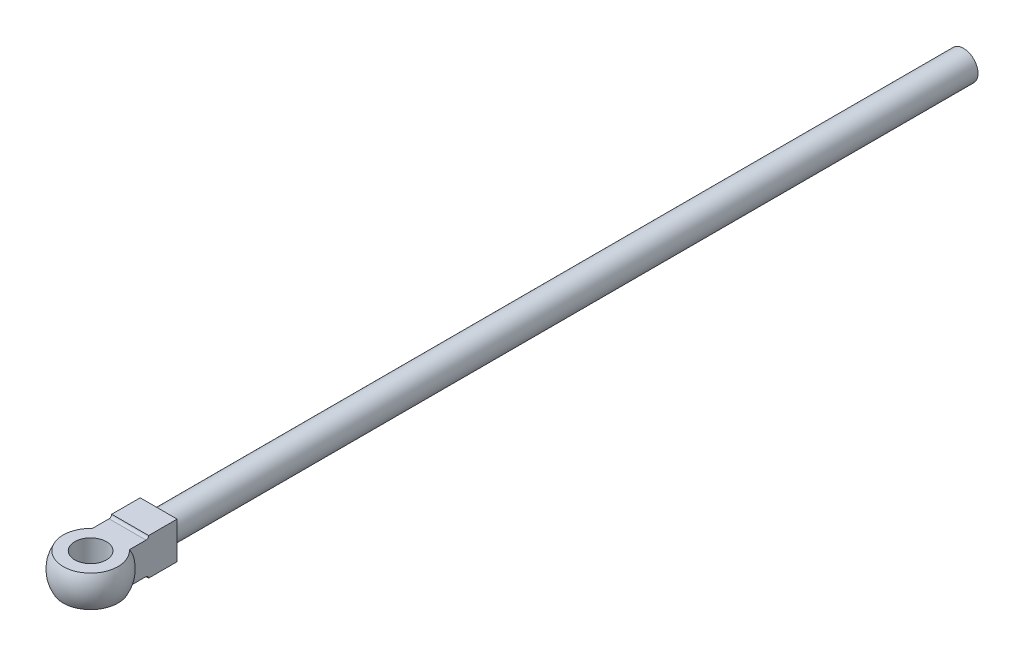
ISO-10303-21;
HEADER;
FILE_DESCRIPTION(('STEP AP214'),'2;1');
FILE_NAME('part.step','',(''),(''),'','','');
FILE_SCHEMA(('AUTOMOTIVE_DESIGN { 1 0 10303 214 1 1 1 1 }'));
ENDSEC;
DATA;
#1=APPLICATION_CONTEXT('core data for automotive mechanical design processes');
#2=APPLICATION_PROTOCOL_DEFINITION('international standard','automotive_design',2000,#1);
#3=PRODUCT_CONTEXT('',#1,'mechanical');
#4=PRODUCT('Part','Part','',(#3));
#5=PRODUCT_RELATED_PRODUCT_CATEGORY('part','',(#4));
#6=PRODUCT_DEFINITION_FORMATION('','',#4);
#7=PRODUCT_DEFINITION_CONTEXT('part definition',#1,'design');
#8=PRODUCT_DEFINITION('design','',#6,#7);
#9=PRODUCT_DEFINITION_SHAPE('','',#8);
#10=(LENGTH_UNIT() NAMED_UNIT(*) SI_UNIT(.MILLI.,.METRE.));
#11=(NAMED_UNIT(*) PLANE_ANGLE_UNIT() SI_UNIT($,.RADIAN.));
#12=(NAMED_UNIT(*) SI_UNIT($,.STERADIAN.) SOLID_ANGLE_UNIT());
#13=UNCERTAINTY_MEASURE_WITH_UNIT(LENGTH_MEASURE(1.E-05),#10,'distance_accuracy_value','');
#14=(GEOMETRIC_REPRESENTATION_CONTEXT(3) GLOBAL_UNCERTAINTY_ASSIGNED_CONTEXT((#13)) GLOBAL_UNIT_ASSIGNED_CONTEXT((#10,
#11,#12)) REPRESENTATION_CONTEXT('',''));
#15=CARTESIAN_POINT('',(0.,0.,0.));
#16=DIRECTION('',(0.,0.,1.));
#17=DIRECTION('',(1.,0.,0.));
#18=AXIS2_PLACEMENT_3D('',#15,#16,#17);
#19=CARTESIAN_POINT('',(-30.,30.,0.));
#20=DIRECTION('',(0.,-1.,0.));
#21=DIRECTION('',(0.,0.,-1.));
#22=AXIS2_PLACEMENT_3D('',#19,#20,#21);
#23=PLANE('',#22);
#24=DIRECTION('',(0.,0.,1.));
#25=VECTOR('',#24,1.);
#26=CARTESIAN_POINT('',(35.,30.,0.));
#27=LINE('',#26,#25);
#28=CARTESIAN_POINT('',(35.,30.,-70.));
#29=VERTEX_POINT('',#28);
#30=CARTESIAN_POINT('',(35.,30.,-38.405728739343));
#31=VERTEX_POINT('',#30);
#32=EDGE_CURVE('E198',#29,#31,#27,.T.);
#33=ORIENTED_EDGE('',*,*,#32,.F.);
#34=DIRECTION('',(1.,0.,0.));
#35=VECTOR('',#34,1.);
#36=CARTESIAN_POINT('',(-35.,30.,-70.));
#37=LINE('',#36,#35);
#38=CARTESIAN_POINT('',(-35.,30.,-70.));
#39=VERTEX_POINT('',#38);
#40=EDGE_CURVE('E151',#29,#39,#37,.F.);
#41=ORIENTED_EDGE('',*,*,#40,.T.);
#42=DIRECTION('',(0.,0.,-1.));
#43=VECTOR('',#42,1.);
#44=CARTESIAN_POINT('',(-35.,30.,0.));
#45=LINE('',#44,#43);
#46=CARTESIAN_POINT('',(-35.,30.,-38.405728739343));
#47=VERTEX_POINT('',#46);
#48=EDGE_CURVE('E193',#47,#39,#45,.T.);
#49=ORIENTED_EDGE('',*,*,#48,.F.);
#50=CARTESIAN_POINT('',(0.,30.,0.));
#51=DIRECTION('',(0.,-1.,0.));
#52=DIRECTION('',(0.,0.,-1.));
#53=AXIS2_PLACEMENT_3D('',#50,#51,#52);
#54=CIRCLE('',#53,51.9615242270663);
#55=EDGE_CURVE('E141',#31,#47,#54,.T.);
#56=ORIENTED_EDGE('',*,*,#55,.F.);
#57=EDGE_LOOP('',(#33,#41,#49,#56));
#58=FACE_BOUND('',#57,.T.);
#59=CARTESIAN_POINT('',(0.,30.,0.));
#60=DIRECTION('',(0.,-1.,0.));
#61=DIRECTION('',(0.,0.,-1.));
#62=AXIS2_PLACEMENT_3D('',#59,#60,#61);
#63=CIRCLE('',#62,30.);
#64=CARTESIAN_POINT('',(0.,30.,-30.));
#65=VERTEX_POINT('',#64);
#66=EDGE_CURVE('E211',#65,#65,#63,.T.);
#67=ORIENTED_EDGE('',*,*,#66,.T.);
#68=EDGE_LOOP('',(#67));
#69=FACE_BOUND('',#68,.T.);
#70=ADVANCED_FACE('F36',(#58,#69),#23,.F.);
#71=CARTESIAN_POINT('',(0.,0.,0.));
#72=DIRECTION('',(0.,-1.,0.));
#73=DIRECTION('',(-1.,0.,0.));
#74=AXIS2_PLACEMENT_3D('',#71,#72,#73);
#75=SPHERICAL_SURFACE('',#74,60.);
#76=CARTESIAN_POINT('',(35.,0.,0.));
#77=DIRECTION('',(-1.,0.,0.));
#78=DIRECTION('',(0.,0.,1.));
#79=AXIS2_PLACEMENT_3D('',#76,#77,#78);
#80=CIRCLE('',#79,48.7339717240448);
#81=CARTESIAN_POINT('',(35.,-30.,-38.405728739343));
#82=VERTEX_POINT('',#81);
#83=EDGE_CURVE('E209',#31,#82,#80,.T.);
#84=ORIENTED_EDGE('',*,*,#83,.F.);
#85=ORIENTED_EDGE('',*,*,#55,.T.);
#86=CARTESIAN_POINT('',(-35.,0.,0.));
#87=DIRECTION('',(1.,0.,0.));
#88=DIRECTION('',(0.,0.,-1.));
#89=AXIS2_PLACEMENT_3D('',#86,#87,#88);
#90=CIRCLE('',#89,48.7339717240448);
#91=CARTESIAN_POINT('',(-35.,-30.,-38.405728739343));
#92=VERTEX_POINT('',#91);
#93=EDGE_CURVE('E207',#92,#47,#90,.T.);
#94=ORIENTED_EDGE('',*,*,#93,.F.);
#95=CARTESIAN_POINT('',(0.,-30.,0.));
#96=DIRECTION('',(0.,-1.,0.));
#97=DIRECTION('',(0.,0.,-1.));
#98=AXIS2_PLACEMENT_3D('',#95,#96,#97);
#99=CIRCLE('',#98,51.9615242270663);
#100=EDGE_CURVE('E146',#82,#92,#99,.T.);
#101=ORIENTED_EDGE('',*,*,#100,.F.);
#102=EDGE_LOOP('',(#84,#85,#94,#101));
#103=FACE_BOUND('',#102,.T.);
#104=ADVANCED_FACE('F223',(#103),#75,.T.);
#105=CARTESIAN_POINT('',(-30.,-30.,0.));
#106=DIRECTION('',(0.,1.,0.));
#107=DIRECTION('',(0.,0.,1.));
#108=AXIS2_PLACEMENT_3D('',#105,#106,#107);
#109=PLANE('',#108);
#110=DIRECTION('',(0.,0.,1.));
#111=VECTOR('',#110,1.);
#112=CARTESIAN_POINT('',(-35.,-30.,0.));
#113=LINE('',#112,#111);
#114=CARTESIAN_POINT('',(-35.,-30.,-70.));
#115=VERTEX_POINT('',#114);
#116=EDGE_CURVE('E185',#115,#92,#113,.T.);
#117=ORIENTED_EDGE('',*,*,#116,.F.);
#118=DIRECTION('',(-1.,0.,0.));
#119=VECTOR('',#118,1.);
#120=CARTESIAN_POINT('',(35.,-30.,-70.));
#121=LINE('',#120,#119);
#122=CARTESIAN_POINT('',(35.,-30.,-70.));
#123=VERTEX_POINT('',#122);
#124=EDGE_CURVE('E144',#115,#123,#121,.F.);
#125=ORIENTED_EDGE('',*,*,#124,.T.);
#126=DIRECTION('',(0.,0.,-1.));
#127=VECTOR('',#126,1.);
#128=CARTESIAN_POINT('',(35.,-30.,0.));
#129=LINE('',#128,#127);
#130=EDGE_CURVE('E124',#82,#123,#129,.T.);
#131=ORIENTED_EDGE('',*,*,#130,.F.);
#132=ORIENTED_EDGE('',*,*,#100,.T.);
#133=EDGE_LOOP('',(#117,#125,#131,#132));
#134=FACE_BOUND('',#133,.T.);
#135=CARTESIAN_POINT('',(0.,-30.,0.));
#136=DIRECTION('',(0.,-1.,0.));
#137=DIRECTION('',(0.,0.,-1.));
#138=AXIS2_PLACEMENT_3D('',#135,#136,#137);
#139=CIRCLE('',#138,30.);
#140=CARTESIAN_POINT('',(0.,-30.,-30.));
#141=VERTEX_POINT('',#140);
#142=EDGE_CURVE('E214',#141,#141,#139,.T.);
#143=ORIENTED_EDGE('',*,*,#142,.F.);
#144=EDGE_LOOP('',(#143));
#145=FACE_BOUND('',#144,.T.);
#146=ADVANCED_FACE('F219',(#134,#145),#109,.F.);
#147=CARTESIAN_POINT('',(0.,0.,0.));
#148=DIRECTION('',(0.,-1.,0.));
#149=DIRECTION('',(0.,0.,-1.));
#150=AXIS2_PLACEMENT_3D('',#147,#148,#149);
#151=CYLINDRICAL_SURFACE('',#150,30.);
#152=ORIENTED_EDGE('',*,*,#66,.F.);
#153=EDGE_LOOP('',(#152));
#154=FACE_BOUND('',#153,.T.);
#155=ORIENTED_EDGE('',*,*,#142,.T.);
#156=EDGE_LOOP('',(#155));
#157=FACE_BOUND('',#156,.T.);
#158=ADVANCED_FACE('F298',(#154,#157),#151,.F.);
#159=CARTESIAN_POINT('',(35.,-35.,0.));
#160=DIRECTION('',(-1.,0.,0.));
#161=DIRECTION('',(0.,0.,1.));
#162=AXIS2_PLACEMENT_3D('',#159,#160,#161);
#163=PLANE('',#162);
#164=DIRECTION('',(0.,0.,-1.));
#165=VECTOR('',#164,1.);
#166=CARTESIAN_POINT('',(35.,-35.,0.));
#167=LINE('',#166,#165);
#168=CARTESIAN_POINT('',(35.,-35.,-75.));
#169=VERTEX_POINT('',#168);
#170=CARTESIAN_POINT('',(35.,-35.,-129.));
#171=VERTEX_POINT('',#170);
#172=EDGE_CURVE('E121',#169,#171,#167,.T.);
#173=ORIENTED_EDGE('',*,*,#172,.T.);
#174=DIRECTION('',(0.,1.,0.));
#175=VECTOR('',#174,1.);
#176=CARTESIAN_POINT('',(35.,35.,-129.));
#177=LINE('',#176,#175);
#178=CARTESIAN_POINT('',(35.,35.,-129.));
#179=VERTEX_POINT('',#178);
#180=EDGE_CURVE('E163',#171,#179,#177,.T.);
#181=ORIENTED_EDGE('',*,*,#180,.T.);
#182=DIRECTION('',(0.,0.,-1.));
#183=VECTOR('',#182,1.);
#184=CARTESIAN_POINT('',(35.,35.,0.));
#185=LINE('',#184,#183);
#186=CARTESIAN_POINT('',(35.,35.,-75.));
#187=VERTEX_POINT('',#186);
#188=EDGE_CURVE('E205',#187,#179,#185,.T.);
#189=ORIENTED_EDGE('',*,*,#188,.F.);
#190=CARTESIAN_POINT('',(35.,35.,-70.));
#191=DIRECTION('',(-1.,0.,0.));
#192=DIRECTION('',(0.,0.,1.));
#193=AXIS2_PLACEMENT_3D('',#190,#191,#192);
#194=CIRCLE('',#193,5.);
#195=EDGE_CURVE('E128',#187,#29,#194,.T.);
#196=ORIENTED_EDGE('',*,*,#195,.T.);
#197=ORIENTED_EDGE('',*,*,#32,.T.);
#198=ORIENTED_EDGE('',*,*,#83,.T.);
#199=ORIENTED_EDGE('',*,*,#130,.T.);
#200=CARTESIAN_POINT('',(35.,-35.,-70.));
#201=DIRECTION('',(-1.,0.,0.));
#202=DIRECTION('',(0.,0.,1.));
#203=AXIS2_PLACEMENT_3D('',#200,#201,#202);
#204=CIRCLE('',#203,5.);
#205=EDGE_CURVE('E117',#123,#169,#204,.T.);
#206=ORIENTED_EDGE('',*,*,#205,.T.);
#207=EDGE_LOOP('',(#173,#181,#189,#196,#197,#198,#199,#206));
#208=FACE_BOUND('',#207,.T.);
#209=ADVANCED_FACE('F119',(#208),#163,.F.);
#210=CARTESIAN_POINT('',(-35.,-35.,0.));
#211=DIRECTION('',(1.,0.,0.));
#212=DIRECTION('',(0.,0.,-1.));
#213=AXIS2_PLACEMENT_3D('',#210,#211,#212);
#214=PLANE('',#213);
#215=DIRECTION('',(0.,0.,-1.));
#216=VECTOR('',#215,1.);
#217=CARTESIAN_POINT('',(-35.,35.,0.));
#218=LINE('',#217,#216);
#219=CARTESIAN_POINT('',(-35.,35.,-75.));
#220=VERTEX_POINT('',#219);
#221=CARTESIAN_POINT('',(-35.,35.,-129.));
#222=VERTEX_POINT('',#221);
#223=EDGE_CURVE('E203',#220,#222,#218,.T.);
#224=ORIENTED_EDGE('',*,*,#223,.T.);
#225=DIRECTION('',(0.,-1.,0.));
#226=VECTOR('',#225,1.);
#227=CARTESIAN_POINT('',(-35.,-35.,-129.));
#228=LINE('',#227,#226);
#229=CARTESIAN_POINT('',(-35.,-35.,-129.));
#230=VERTEX_POINT('',#229);
#231=EDGE_CURVE('E45',#222,#230,#228,.T.);
#232=ORIENTED_EDGE('',*,*,#231,.T.);
#233=DIRECTION('',(0.,0.,-1.));
#234=VECTOR('',#233,1.);
#235=CARTESIAN_POINT('',(-35.,-35.,0.));
#236=LINE('',#235,#234);
#237=CARTESIAN_POINT('',(-35.,-35.,-75.));
#238=VERTEX_POINT('',#237);
#239=EDGE_CURVE('E136',#238,#230,#236,.T.);
#240=ORIENTED_EDGE('',*,*,#239,.F.);
#241=CARTESIAN_POINT('',(-35.,-35.,-70.));
#242=DIRECTION('',(1.,0.,0.));
#243=DIRECTION('',(0.,0.,-1.));
#244=AXIS2_PLACEMENT_3D('',#241,#242,#243);
#245=CIRCLE('',#244,5.);
#246=EDGE_CURVE('E129',#238,#115,#245,.T.);
#247=ORIENTED_EDGE('',*,*,#246,.T.);
#248=ORIENTED_EDGE('',*,*,#116,.T.);
#249=ORIENTED_EDGE('',*,*,#93,.T.);
#250=ORIENTED_EDGE('',*,*,#48,.T.);
#251=CARTESIAN_POINT('',(-35.,35.,-70.));
#252=DIRECTION('',(1.,0.,0.));
#253=DIRECTION('',(0.,0.,-1.));
#254=AXIS2_PLACEMENT_3D('',#251,#252,#253);
#255=CIRCLE('',#254,5.);
#256=EDGE_CURVE('E155',#39,#220,#255,.T.);
#257=ORIENTED_EDGE('',*,*,#256,.T.);
#258=EDGE_LOOP('',(#224,#232,#240,#247,#248,#249,#250,#257));
#259=FACE_BOUND('',#258,.T.);
#260=ADVANCED_FACE('F226',(#259),#214,.F.);
#261=CARTESIAN_POINT('',(-35.,35.,0.));
#262=DIRECTION('',(0.,-1.,0.));
#263=DIRECTION('',(0.,0.,-1.));
#264=AXIS2_PLACEMENT_3D('',#261,#262,#263);
#265=PLANE('',#264);
#266=ORIENTED_EDGE('',*,*,#188,.T.);
#267=DIRECTION('',(-1.,0.,0.));
#268=VECTOR('',#267,1.);
#269=CARTESIAN_POINT('',(-35.,35.,-129.));
#270=LINE('',#269,#268);
#271=EDGE_CURVE('E60',#179,#222,#270,.T.);
#272=ORIENTED_EDGE('',*,*,#271,.T.);
#273=ORIENTED_EDGE('',*,*,#223,.F.);
#274=DIRECTION('',(1.,0.,0.));
#275=VECTOR('',#274,1.);
#276=CARTESIAN_POINT('',(-35.,35.,-75.));
#277=LINE('',#276,#275);
#278=EDGE_CURVE('E140',#220,#187,#277,.T.);
#279=ORIENTED_EDGE('',*,*,#278,.T.);
#280=EDGE_LOOP('',(#266,#272,#273,#279));
#281=FACE_BOUND('',#280,.T.);
#282=ADVANCED_FACE('F234',(#281),#265,.F.);
#283=CARTESIAN_POINT('',(-35.,-35.,0.));
#284=DIRECTION('',(0.,1.,0.));
#285=DIRECTION('',(0.,0.,1.));
#286=AXIS2_PLACEMENT_3D('',#283,#284,#285);
#287=PLANE('',#286);
#288=ORIENTED_EDGE('',*,*,#239,.T.);
#289=DIRECTION('',(1.,0.,0.));
#290=VECTOR('',#289,1.);
#291=CARTESIAN_POINT('',(35.,-35.,-129.));
#292=LINE('',#291,#290);
#293=EDGE_CURVE('E11',#230,#171,#292,.T.);
#294=ORIENTED_EDGE('',*,*,#293,.T.);
#295=ORIENTED_EDGE('',*,*,#172,.F.);
#296=DIRECTION('',(-1.,0.,0.));
#297=VECTOR('',#296,1.);
#298=CARTESIAN_POINT('',(-35.,-35.,-75.));
#299=LINE('',#298,#297);
#300=EDGE_CURVE('E134',#169,#238,#299,.T.);
#301=ORIENTED_EDGE('',*,*,#300,.T.);
#302=EDGE_LOOP('',(#288,#294,#295,#301));
#303=FACE_BOUND('',#302,.T.);
#304=ADVANCED_FACE('F133',(#303),#287,.F.);
#305=CARTESIAN_POINT('',(0.,0.,-130.));
#306=DIRECTION('',(0.,0.,-1.));
#307=DIRECTION('',(-1.,0.,0.));
#308=AXIS2_PLACEMENT_3D('',#305,#306,#307);
#309=PLANE('',#308);
#310=DIRECTION('',(1.,0.,0.));
#311=VECTOR('',#310,1.);
#312=CARTESIAN_POINT('',(35.,34.0000000000001,-130.));
#313=LINE('',#312,#311);
#314=CARTESIAN_POINT('',(-34.0000000000001,34.0000000000001,-130.));
#315=VERTEX_POINT('',#314);
#316=CARTESIAN_POINT('',(34.0000000000001,34.0000000000001,-130.));
#317=VERTEX_POINT('',#316);
#318=EDGE_CURVE('E169',#315,#317,#313,.T.);
#319=ORIENTED_EDGE('',*,*,#318,.T.);
#320=DIRECTION('',(0.,-1.,0.));
#321=VECTOR('',#320,1.);
#322=CARTESIAN_POINT('',(34.0000000000001,-35.,-130.));
#323=LINE('',#322,#321);
#324=CARTESIAN_POINT('',(34.0000000000001,-34.0000000000001,-130.));
#325=VERTEX_POINT('',#324);
#326=EDGE_CURVE('E171',#317,#325,#323,.T.);
#327=ORIENTED_EDGE('',*,*,#326,.T.);
#328=DIRECTION('',(-1.,0.,0.));
#329=VECTOR('',#328,1.);
#330=CARTESIAN_POINT('',(-35.,-34.0000000000001,-130.));
#331=LINE('',#330,#329);
#332=CARTESIAN_POINT('',(-34.0000000000001,-34.0000000000001,-130.));
#333=VERTEX_POINT('',#332);
#334=EDGE_CURVE('E165',#325,#333,#331,.T.);
#335=ORIENTED_EDGE('',*,*,#334,.T.);
#336=DIRECTION('',(0.,1.,0.));
#337=VECTOR('',#336,1.);
#338=CARTESIAN_POINT('',(-34.0000000000001,35.,-130.));
#339=LINE('',#338,#337);
#340=EDGE_CURVE('E167',#333,#315,#339,.T.);
#341=ORIENTED_EDGE('',*,*,#340,.T.);
#342=EDGE_LOOP('',(#319,#327,#335,#341));
#343=FACE_BOUND('',#342,.T.);
#344=CARTESIAN_POINT('',(0.,0.,-130.));
#345=DIRECTION('',(0.,0.,-1.));
#346=DIRECTION('',(-1.,0.,0.));
#347=AXIS2_PLACEMENT_3D('',#344,#345,#346);
#348=CIRCLE('',#347,28.5);
#349=CARTESIAN_POINT('',(-28.5,0.,-130.));
#350=VERTEX_POINT('',#349);
#351=EDGE_CURVE('E160',#350,#350,#348,.F.);
#352=ORIENTED_EDGE('',*,*,#351,.T.);
#353=EDGE_LOOP('',(#352));
#354=FACE_BOUND('',#353,.T.);
#355=ADVANCED_FACE('F278',(#343,#354),#309,.T.);
#356=CARTESIAN_POINT('',(0.,0.,-1655.));
#357=DIRECTION('',(0.,0.,1.));
#358=DIRECTION('',(1.,0.,0.));
#359=AXIS2_PLACEMENT_3D('',#356,#357,#358);
#360=CYLINDRICAL_SURFACE('',#359,27.5);
#361=CARTESIAN_POINT('',(0.,0.,-131.));
#362=DIRECTION('',(0.,0.,-1.));
#363=DIRECTION('',(-1.,0.,0.));
#364=AXIS2_PLACEMENT_3D('',#361,#362,#363);
#365=CIRCLE('',#364,27.5);
#366=CARTESIAN_POINT('',(-27.5,0.,-131.));
#367=VERTEX_POINT('',#366);
#368=EDGE_CURVE('E157',#367,#367,#365,.T.);
#369=ORIENTED_EDGE('',*,*,#368,.T.);
#370=EDGE_LOOP('',(#369));
#371=FACE_BOUND('',#370,.T.);
#372=CARTESIAN_POINT('',(0.,0.,-1655.));
#373=DIRECTION('',(0.,0.,-1.));
#374=DIRECTION('',(-1.,0.,0.));
#375=AXIS2_PLACEMENT_3D('',#372,#373,#374);
#376=CIRCLE('',#375,27.5);
#377=CARTESIAN_POINT('',(-27.5,0.,-1655.));
#378=VERTEX_POINT('',#377);
#379=EDGE_CURVE('E137',#378,#378,#376,.T.);
#380=ORIENTED_EDGE('',*,*,#379,.F.);
#381=EDGE_LOOP('',(#380));
#382=FACE_BOUND('',#381,.T.);
#383=ADVANCED_FACE('F275',(#371,#382),#360,.T.);
#384=CARTESIAN_POINT('',(0.,0.,-1655.));
#385=DIRECTION('',(0.,0.,-1.));
#386=DIRECTION('',(-1.,0.,0.));
#387=AXIS2_PLACEMENT_3D('',#384,#385,#386);
#388=PLANE('',#387);
#389=ORIENTED_EDGE('',*,*,#379,.T.);
#390=EDGE_LOOP('',(#389));
#391=FACE_BOUND('',#390,.T.);
#392=ADVANCED_FACE('F261',(#391),#388,.T.);
#393=CARTESIAN_POINT('',(0.,-35.,-70.));
#394=DIRECTION('',(1.,0.,0.));
#395=DIRECTION('',(0.,0.,-1.));
#396=AXIS2_PLACEMENT_3D('',#393,#394,#395);
#397=CYLINDRICAL_SURFACE('',#396,5.);
#398=ORIENTED_EDGE('',*,*,#205,.F.);
#399=ORIENTED_EDGE('',*,*,#124,.F.);
#400=ORIENTED_EDGE('',*,*,#246,.F.);
#401=ORIENTED_EDGE('',*,*,#300,.F.);
#402=EDGE_LOOP('',(#398,#399,#400,#401));
#403=FACE_BOUND('',#402,.T.);
#404=ADVANCED_FACE('F139',(#403),#397,.F.);
#405=CARTESIAN_POINT('',(0.,35.,-70.));
#406=DIRECTION('',(-1.,0.,0.));
#407=DIRECTION('',(0.,0.,1.));
#408=AXIS2_PLACEMENT_3D('',#405,#406,#407);
#409=CYLINDRICAL_SURFACE('',#408,5.);
#410=ORIENTED_EDGE('',*,*,#256,.F.);
#411=ORIENTED_EDGE('',*,*,#40,.F.);
#412=ORIENTED_EDGE('',*,*,#195,.F.);
#413=ORIENTED_EDGE('',*,*,#278,.F.);
#414=EDGE_LOOP('',(#410,#411,#412,#413));
#415=FACE_BOUND('',#414,.T.);
#416=ADVANCED_FACE('F232',(#415),#409,.F.);
#417=CARTESIAN_POINT('',(0.,0.,-131.));
#418=DIRECTION('',(0.,0.,-1.));
#419=DIRECTION('',(-1.,0.,0.));
#420=AXIS2_PLACEMENT_3D('',#417,#418,#419);
#421=TOROIDAL_SURFACE('',#420,28.5,1.);
#422=ORIENTED_EDGE('',*,*,#351,.F.);
#423=EDGE_LOOP('',(#422));
#424=FACE_BOUND('',#423,.T.);
#425=ORIENTED_EDGE('',*,*,#368,.F.);
#426=EDGE_LOOP('',(#425));
#427=FACE_BOUND('',#426,.T.);
#428=ADVANCED_FACE('F264',(#424,#427),#421,.F.);
#429=CARTESIAN_POINT('',(-35.,-35.,-129.));
#430=DIRECTION('',(-0.707106781186548,0.,-0.707106781186548));
#431=DIRECTION('',(0.,1.,0.));
#432=AXIS2_PLACEMENT_3D('',#429,#430,#431);
#433=PLANE('',#432);
#434=DIRECTION('',(0.577350269189626,-0.577350269189626,-0.577350269189626));
#435=VECTOR('',#434,1.);
#436=CARTESIAN_POINT('',(-11.6666666666667,11.6666666666667,-152.333333333333));
#437=LINE('',#436,#435);
#438=EDGE_CURVE('E179',#315,#222,#437,.F.);
#439=ORIENTED_EDGE('',*,*,#438,.F.);
#440=ORIENTED_EDGE('',*,*,#340,.F.);
#441=DIRECTION('',(0.577350269189626,0.577350269189626,-0.577350269189626));
#442=VECTOR('',#441,1.);
#443=CARTESIAN_POINT('',(-35.,-35.,-129.));
#444=LINE('',#443,#442);
#445=EDGE_CURVE('E40',#230,#333,#444,.T.);
#446=ORIENTED_EDGE('',*,*,#445,.F.);
#447=ORIENTED_EDGE('',*,*,#231,.F.);
#448=EDGE_LOOP('',(#439,#440,#446,#447));
#449=FACE_BOUND('',#448,.T.);
#450=ADVANCED_FACE('F38',(#449),#433,.T.);
#451=CARTESIAN_POINT('',(-35.,-35.,-129.));
#452=DIRECTION('',(0.,-0.707106781186548,-0.707106781186548));
#453=DIRECTION('',(-1.,0.,0.));
#454=AXIS2_PLACEMENT_3D('',#451,#452,#453);
#455=PLANE('',#454);
#456=ORIENTED_EDGE('',*,*,#445,.T.);
#457=ORIENTED_EDGE('',*,*,#334,.F.);
#458=DIRECTION('',(0.577350269189626,-0.577350269189626,0.577350269189626));
#459=VECTOR('',#458,1.);
#460=CARTESIAN_POINT('',(11.6666666666667,-11.6666666666667,-152.333333333333));
#461=LINE('',#460,#459);
#462=EDGE_CURVE('E178',#171,#325,#461,.F.);
#463=ORIENTED_EDGE('',*,*,#462,.F.);
#464=ORIENTED_EDGE('',*,*,#293,.F.);
#465=EDGE_LOOP('',(#456,#457,#463,#464));
#466=FACE_BOUND('',#465,.T.);
#467=ADVANCED_FACE('F243',(#466),#455,.T.);
#468=CARTESIAN_POINT('',(-35.,35.,-129.));
#469=DIRECTION('',(0.,0.707106781186548,-0.707106781186548));
#470=DIRECTION('',(1.,0.,0.));
#471=AXIS2_PLACEMENT_3D('',#468,#469,#470);
#472=PLANE('',#471);
#473=ORIENTED_EDGE('',*,*,#438,.T.);
#474=ORIENTED_EDGE('',*,*,#271,.F.);
#475=DIRECTION('',(-0.577350269189626,-0.577350269189626,-0.577350269189626));
#476=VECTOR('',#475,1.);
#477=CARTESIAN_POINT('',(11.6666666666667,11.6666666666667,-152.333333333333));
#478=LINE('',#477,#476);
#479=EDGE_CURVE('E176',#317,#179,#478,.F.);
#480=ORIENTED_EDGE('',*,*,#479,.F.);
#481=ORIENTED_EDGE('',*,*,#318,.F.);
#482=EDGE_LOOP('',(#473,#474,#480,#481));
#483=FACE_BOUND('',#482,.T.);
#484=ADVANCED_FACE('F241',(#483),#472,.T.);
#485=CARTESIAN_POINT('',(35.,-35.,-129.));
#486=DIRECTION('',(0.707106781186548,0.,-0.707106781186548));
#487=DIRECTION('',(0.,-1.,0.));
#488=AXIS2_PLACEMENT_3D('',#485,#486,#487);
#489=PLANE('',#488);
#490=ORIENTED_EDGE('',*,*,#462,.T.);
#491=ORIENTED_EDGE('',*,*,#326,.F.);
#492=ORIENTED_EDGE('',*,*,#479,.T.);
#493=ORIENTED_EDGE('',*,*,#180,.F.);
#494=EDGE_LOOP('',(#490,#491,#492,#493));
#495=FACE_BOUND('',#494,.T.);
#496=ADVANCED_FACE('F238',(#495),#489,.T.);
#497=CLOSED_SHELL('',(#70,#104,#146,#158,#209,#260,#282,#304,#355,#383,#392,#404,#416,#428,#450,
#467,#484,#496));
#498=MANIFOLD_SOLID_BREP('B2',#497);
#499=ADVANCED_BREP_SHAPE_REPRESENTATION('',(#18,#498),#14);
#500=SHAPE_DEFINITION_REPRESENTATION(#9,#499);
ENDSEC;
END-ISO-10303-21;
